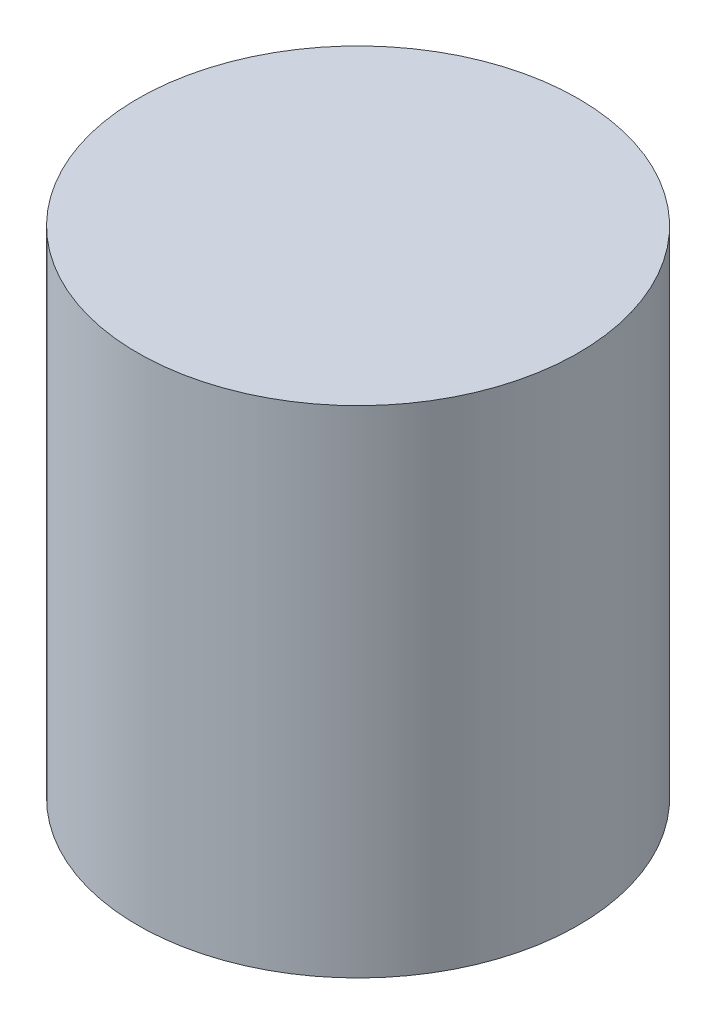
ISO-10303-21;
HEADER;
FILE_DESCRIPTION(('STEP AP214'),'2;1');
FILE_NAME('part.step','',(''),(''),'','','');
FILE_SCHEMA(('AUTOMOTIVE_DESIGN { 1 0 10303 214 1 1 1 1 }'));
ENDSEC;
DATA;
#1=APPLICATION_CONTEXT('core data for automotive mechanical design processes');
#2=APPLICATION_PROTOCOL_DEFINITION('international standard','automotive_design',2000,#1);
#3=PRODUCT_CONTEXT('',#1,'mechanical');
#4=PRODUCT('Part','Part','',(#3));
#5=PRODUCT_RELATED_PRODUCT_CATEGORY('part','',(#4));
#6=PRODUCT_DEFINITION_FORMATION('','',#4);
#7=PRODUCT_DEFINITION_CONTEXT('part definition',#1,'design');
#8=PRODUCT_DEFINITION('design','',#6,#7);
#9=PRODUCT_DEFINITION_SHAPE('','',#8);
#10=(LENGTH_UNIT() NAMED_UNIT(*) SI_UNIT(.MILLI.,.METRE.));
#11=(NAMED_UNIT(*) PLANE_ANGLE_UNIT() SI_UNIT($,.RADIAN.));
#12=(NAMED_UNIT(*) SI_UNIT($,.STERADIAN.) SOLID_ANGLE_UNIT());
#13=UNCERTAINTY_MEASURE_WITH_UNIT(LENGTH_MEASURE(1.E-05),#10,'distance_accuracy_value','');
#14=(GEOMETRIC_REPRESENTATION_CONTEXT(3) GLOBAL_UNCERTAINTY_ASSIGNED_CONTEXT((#13)) GLOBAL_UNIT_ASSIGNED_CONTEXT((#10,
#11,#12)) REPRESENTATION_CONTEXT('',''));
#15=CARTESIAN_POINT('',(0.,0.,0.));
#16=DIRECTION('',(0.,0.,1.));
#17=DIRECTION('',(1.,0.,0.));
#18=AXIS2_PLACEMENT_3D('',#15,#16,#17);
#19=CARTESIAN_POINT('',(0.,90.,0.));
#20=DIRECTION('',(0.,-1.,0.));
#21=DIRECTION('',(0.,0.,-1.));
#22=AXIS2_PLACEMENT_3D('',#19,#20,#21);
#23=CYLINDRICAL_SURFACE('',#22,40.);
#24=CARTESIAN_POINT('',(0.,90.,0.));
#25=DIRECTION('',(0.,1.,0.));
#26=DIRECTION('',(0.,0.,1.));
#27=AXIS2_PLACEMENT_3D('',#24,#25,#26);
#28=CIRCLE('',#27,40.);
#29=CARTESIAN_POINT('',(0.,90.,-40.));
#30=VERTEX_POINT('',#29);
#31=EDGE_CURVE('E10',#30,#30,#28,.T.);
#32=CARTESIAN_POINT('',(0.,0.,0.));
#33=DIRECTION('',(0.,1.,0.));
#34=DIRECTION('',(0.,0.,1.));
#35=AXIS2_PLACEMENT_3D('',#32,#33,#34);
#36=CIRCLE('',#35,40.);
#37=CARTESIAN_POINT('',(0.,0.,-40.));
#38=VERTEX_POINT('',#37);
#39=EDGE_CURVE('E38',#38,#38,#36,.T.);
#40=CARTESIAN_POINT('',(0.,90.,-40.));
#41=CARTESIAN_POINT('',(0.,89.0625,-40.));
#42=CARTESIAN_POINT('',(0.,88.125,-40.));
#43=CARTESIAN_POINT('',(0.,86.25,-40.));
#44=CARTESIAN_POINT('',(0.,85.3125,-40.));
#45=CARTESIAN_POINT('',(0.,83.4375,-40.));
#46=CARTESIAN_POINT('',(0.,82.5,-40.));
#47=CARTESIAN_POINT('',(0.,80.625,-40.));
#48=CARTESIAN_POINT('',(0.,79.6875,-40.));
#49=CARTESIAN_POINT('',(0.,77.8125,-40.));
#50=CARTESIAN_POINT('',(0.,76.875,-40.));
#51=CARTESIAN_POINT('',(0.,75.,-40.));
#52=CARTESIAN_POINT('',(0.,74.0625,-40.));
#53=CARTESIAN_POINT('',(0.,72.1875,-40.));
#54=CARTESIAN_POINT('',(0.,71.25,-40.));
#55=CARTESIAN_POINT('',(0.,69.375,-40.));
#56=CARTESIAN_POINT('',(0.,68.4375,-40.));
#57=CARTESIAN_POINT('',(0.,66.5625,-40.));
#58=CARTESIAN_POINT('',(0.,65.625,-40.));
#59=CARTESIAN_POINT('',(0.,63.75,-40.));
#60=CARTESIAN_POINT('',(0.,62.8125,-40.));
#61=CARTESIAN_POINT('',(0.,60.9375,-40.));
#62=CARTESIAN_POINT('',(0.,60.,-40.));
#63=CARTESIAN_POINT('',(0.,58.125,-40.));
#64=CARTESIAN_POINT('',(0.,57.1875,-40.));
#65=CARTESIAN_POINT('',(0.,55.3125,-40.));
#66=CARTESIAN_POINT('',(0.,54.375,-40.));
#67=CARTESIAN_POINT('',(0.,52.5,-40.));
#68=CARTESIAN_POINT('',(0.,51.5625,-40.));
#69=CARTESIAN_POINT('',(0.,49.6875,-40.));
#70=CARTESIAN_POINT('',(0.,48.75,-40.));
#71=CARTESIAN_POINT('',(0.,46.875,-40.));
#72=CARTESIAN_POINT('',(0.,45.9375,-40.));
#73=CARTESIAN_POINT('',(0.,44.0625,-40.));
#74=CARTESIAN_POINT('',(0.,43.125,-40.));
#75=CARTESIAN_POINT('',(0.,41.25,-40.));
#76=CARTESIAN_POINT('',(0.,40.3125,-40.));
#77=CARTESIAN_POINT('',(0.,38.4375,-40.));
#78=CARTESIAN_POINT('',(0.,37.5,-40.));
#79=CARTESIAN_POINT('',(0.,35.625,-40.));
#80=CARTESIAN_POINT('',(0.,34.6875,-40.));
#81=CARTESIAN_POINT('',(0.,32.8125,-40.));
#82=CARTESIAN_POINT('',(0.,31.875,-40.));
#83=CARTESIAN_POINT('',(0.,30.,-40.));
#84=CARTESIAN_POINT('',(0.,29.0625,-40.));
#85=CARTESIAN_POINT('',(0.,27.1875,-40.));
#86=CARTESIAN_POINT('',(0.,26.25,-40.));
#87=CARTESIAN_POINT('',(0.,24.375,-40.));
#88=CARTESIAN_POINT('',(0.,23.4375,-40.));
#89=CARTESIAN_POINT('',(0.,21.5625,-40.));
#90=CARTESIAN_POINT('',(0.,20.625,-40.));
#91=CARTESIAN_POINT('',(0.,18.75,-40.));
#92=CARTESIAN_POINT('',(0.,17.8125,-40.));
#93=CARTESIAN_POINT('',(0.,15.9375,-40.));
#94=CARTESIAN_POINT('',(0.,15.,-40.));
#95=CARTESIAN_POINT('',(0.,13.125,-40.));
#96=CARTESIAN_POINT('',(0.,12.1875,-40.));
#97=CARTESIAN_POINT('',(0.,10.3125,-40.));
#98=CARTESIAN_POINT('',(0.,9.37499999999999,-40.));
#99=CARTESIAN_POINT('',(0.,7.49999999999999,-40.));
#100=CARTESIAN_POINT('',(0.,6.56249999999999,-40.));
#101=CARTESIAN_POINT('',(0.,4.68749999999999,-40.));
#102=CARTESIAN_POINT('',(0.,3.74999999999998,-40.));
#103=CARTESIAN_POINT('',(0.,1.87499999999998,-40.));
#104=CARTESIAN_POINT('',(0.,0.937499999999986,-40.));
#105=CARTESIAN_POINT('',(0.,0.,-40.));
#106=B_SPLINE_CURVE_WITH_KNOTS('',3,(#40,#41,#42,#43,#44,#45,#46,#47,#48,#49,#50,#51,#52,#53,
#54,#55,#56,#57,#58,#59,#60,#61,#62,#63,#64,#65,#66,#67,#68,#69,#70,#71,#72,#73,#74,#75,#76,#77,
#78,#79,#80,#81,#82,#83,#84,#85,#86,#87,#88,#89,#90,#91,#92,#93,#94,#95,#96,#97,#98,#99,#100,
#101,#102,#103,#104,#105),.UNSPECIFIED.,.F.,.F.,(4,2,2,2,2,2,2,2,2,2,2,2,2,2,2,2,2,2,2,2,2,2,2,
2,2,2,2,2,2,2,2,2,4),(0.,2.8125,5.62499999999999,8.43749999999999,11.25,14.0625,16.875,19.6875,
22.5,25.3125,28.125,30.9375,33.75,36.5625,39.375,42.1875,45.,47.8125,50.625,53.4375,56.25,
59.0625,61.875,64.6875,67.5,70.3125,73.125,75.9375,78.75,81.5625,84.375,87.1875,90.),.UNSPECIFIED.);
#107=EDGE_CURVE('BSEAM35',#30,#38,#106,.T.);
#108=ORIENTED_EDGE('',*,*,#31,.F.);
#109=ORIENTED_EDGE('',*,*,#39,.T.);
#110=ORIENTED_EDGE('',*,*,#107,.T.);
#111=ORIENTED_EDGE('',*,*,#107,.F.);
#112=EDGE_LOOP('',(#108,#110,#109,#111));
#113=FACE_BOUND('',#112,.T.);
#114=ADVANCED_FACE('F35',(#113),#23,.T.);
#115=CARTESIAN_POINT('',(0.,90.,0.));
#116=DIRECTION('',(0.,1.,0.));
#117=DIRECTION('',(0.,0.,1.));
#118=AXIS2_PLACEMENT_3D('',#115,#116,#117);
#119=PLANE('',#118);
#120=ORIENTED_EDGE('',*,*,#31,.T.);
#121=EDGE_LOOP('',(#120));
#122=FACE_BOUND('',#121,.T.);
#123=ADVANCED_FACE('F64',(#122),#119,.T.);
#124=CARTESIAN_POINT('',(0.,0.,0.));
#125=DIRECTION('',(0.,1.,0.));
#126=DIRECTION('',(0.,0.,1.));
#127=AXIS2_PLACEMENT_3D('',#124,#125,#126);
#128=PLANE('',#127);
#129=CARTESIAN_POINT('',(0.,0.,0.));
#130=DIRECTION('',(0.,-1.,0.));
#131=DIRECTION('',(0.,0.,-1.));
#132=AXIS2_PLACEMENT_3D('',#129,#130,#131);
#133=CIRCLE('',#132,25.);
#134=CARTESIAN_POINT('',(0.,0.,-25.));
#135=VERTEX_POINT('',#134);
#136=EDGE_CURVE('E47',#135,#135,#133,.T.);
#137=ORIENTED_EDGE('',*,*,#136,.F.);
#138=EDGE_LOOP('',(#137));
#139=FACE_BOUND('',#138,.T.);
#140=ORIENTED_EDGE('',*,*,#39,.F.);
#141=EDGE_LOOP('',(#140));
#142=FACE_BOUND('',#141,.T.);
#143=ADVANCED_FACE('F58',(#139,#142),#128,.F.);
#144=CARTESIAN_POINT('',(0.,70.,0.));
#145=DIRECTION('',(0.,-1.,0.));
#146=DIRECTION('',(0.,0.,-1.));
#147=AXIS2_PLACEMENT_3D('',#144,#145,#146);
#148=CYLINDRICAL_SURFACE('',#147,25.);
#149=CARTESIAN_POINT('',(0.,70.,0.));
#150=DIRECTION('',(0.,-1.,0.));
#151=DIRECTION('',(0.,0.,-1.));
#152=AXIS2_PLACEMENT_3D('',#149,#150,#151);
#153=CIRCLE('',#152,25.);
#154=CARTESIAN_POINT('',(0.,70.,-25.));
#155=VERTEX_POINT('',#154);
#156=EDGE_CURVE('E45',#155,#155,#153,.T.);
#157=ORIENTED_EDGE('',*,*,#156,.F.);
#158=EDGE_LOOP('',(#157));
#159=FACE_BOUND('',#158,.T.);
#160=ORIENTED_EDGE('',*,*,#136,.T.);
#161=EDGE_LOOP('',(#160));
#162=FACE_BOUND('',#161,.T.);
#163=ADVANCED_FACE('F55',(#159,#162),#148,.F.);
#164=CARTESIAN_POINT('',(0.,70.,0.));
#165=DIRECTION('',(0.,-1.,0.));
#166=DIRECTION('',(0.,0.,-1.));
#167=AXIS2_PLACEMENT_3D('',#164,#165,#166);
#168=PLANE('',#167);
#169=ORIENTED_EDGE('',*,*,#156,.T.);
#170=EDGE_LOOP('',(#169));
#171=FACE_BOUND('',#170,.T.);
#172=ADVANCED_FACE('F53',(#171),#168,.T.);
#173=CLOSED_SHELL('',(#114,#123,#143,#163,#172));
#174=MANIFOLD_SOLID_BREP('B2',#173);
#175=ADVANCED_BREP_SHAPE_REPRESENTATION('',(#18,#174),#14);
#176=SHAPE_DEFINITION_REPRESENTATION(#9,#175);
ENDSEC;
END-ISO-10303-21;
